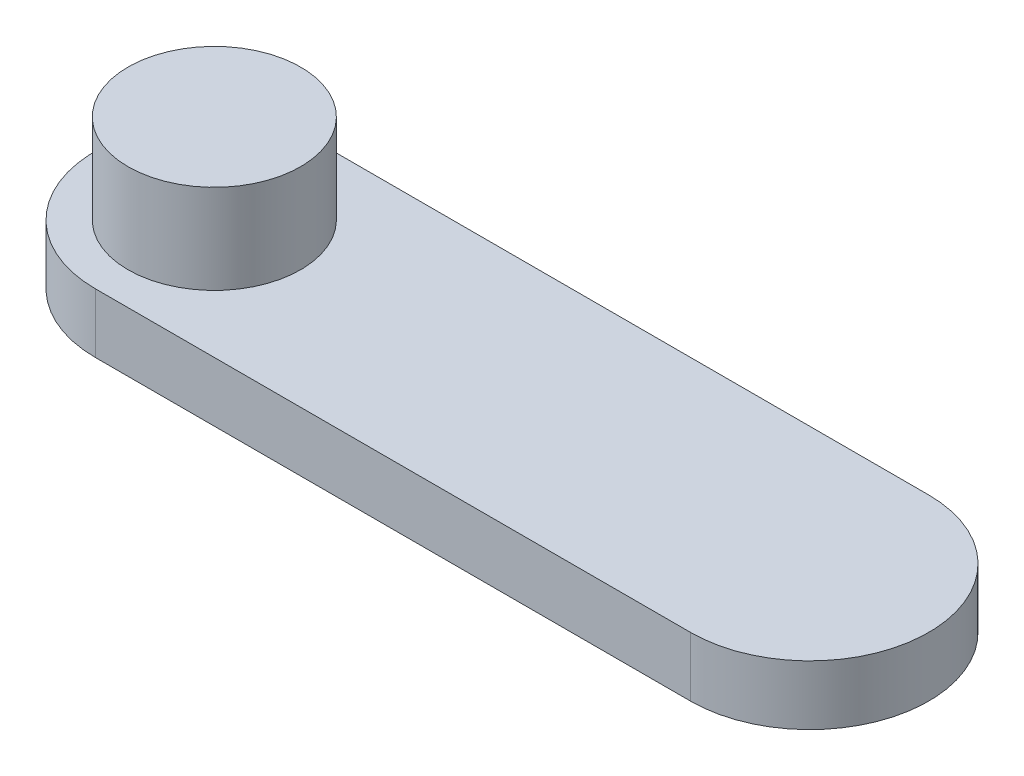
ISO-10303-21;
HEADER;
FILE_DESCRIPTION(('STEP AP214'),'2;1');
FILE_NAME('part.step','',(''),(''),'','','');
FILE_SCHEMA(('AUTOMOTIVE_DESIGN { 1 0 10303 214 1 1 1 1 }'));
ENDSEC;
DATA;
#1=APPLICATION_CONTEXT('core data for automotive mechanical design processes');
#2=APPLICATION_PROTOCOL_DEFINITION('international standard','automotive_design',2000,#1);
#3=PRODUCT_CONTEXT('',#1,'mechanical');
#4=PRODUCT('Part','Part','',(#3));
#5=PRODUCT_RELATED_PRODUCT_CATEGORY('part','',(#4));
#6=PRODUCT_DEFINITION_FORMATION('','',#4);
#7=PRODUCT_DEFINITION_CONTEXT('part definition',#1,'design');
#8=PRODUCT_DEFINITION('design','',#6,#7);
#9=PRODUCT_DEFINITION_SHAPE('','',#8);
#10=(LENGTH_UNIT() NAMED_UNIT(*) SI_UNIT(.MILLI.,.METRE.));
#11=(NAMED_UNIT(*) PLANE_ANGLE_UNIT() SI_UNIT($,.RADIAN.));
#12=(NAMED_UNIT(*) SI_UNIT($,.STERADIAN.) SOLID_ANGLE_UNIT());
#13=UNCERTAINTY_MEASURE_WITH_UNIT(LENGTH_MEASURE(1.E-05),#10,'distance_accuracy_value','');
#14=(GEOMETRIC_REPRESENTATION_CONTEXT(3) GLOBAL_UNCERTAINTY_ASSIGNED_CONTEXT((#13)) GLOBAL_UNIT_ASSIGNED_CONTEXT((#10,
#11,#12)) REPRESENTATION_CONTEXT('',''));
#15=CARTESIAN_POINT('',(0.,0.,0.));
#16=DIRECTION('',(0.,0.,1.));
#17=DIRECTION('',(1.,0.,0.));
#18=AXIS2_PLACEMENT_3D('',#15,#16,#17);
#19=CARTESIAN_POINT('',(-45.7401650890006,10.,0.));
#20=DIRECTION('',(0.,-1.,0.));
#21=DIRECTION('',(0.,0.,-1.));
#22=AXIS2_PLACEMENT_3D('',#19,#20,#21);
#23=CYLINDRICAL_SURFACE('',#22,20.);
#24=CARTESIAN_POINT('',(-45.7401650890006,0.,0.));
#25=DIRECTION('',(0.,1.,0.));
#26=DIRECTION('',(0.,0.,1.));
#27=AXIS2_PLACEMENT_3D('',#24,#25,#26);
#28=CIRCLE('',#27,20.);
#29=CARTESIAN_POINT('',(-45.7401650890006,0.,-20.));
#30=VERTEX_POINT('',#29);
#31=CARTESIAN_POINT('',(-45.7401650890006,0.,20.));
#32=VERTEX_POINT('',#31);
#33=EDGE_CURVE('E95',#30,#32,#28,.T.);
#34=ORIENTED_EDGE('',*,*,#33,.T.);
#35=DIRECTION('',(0.,-1.,0.));
#36=VECTOR('',#35,1.);
#37=CARTESIAN_POINT('',(-45.7401650890006,10.,20.));
#38=LINE('',#37,#36);
#39=CARTESIAN_POINT('',(-45.7401650890006,10.,20.));
#40=VERTEX_POINT('',#39);
#41=EDGE_CURVE('E11',#40,#32,#38,.T.);
#42=ORIENTED_EDGE('',*,*,#41,.F.);
#43=CARTESIAN_POINT('',(-45.7401650890006,10.,0.));
#44=DIRECTION('',(0.,1.,0.));
#45=DIRECTION('',(0.,0.,1.));
#46=AXIS2_PLACEMENT_3D('',#43,#44,#45);
#47=CIRCLE('',#46,20.);
#48=CARTESIAN_POINT('',(-45.7401650890006,10.,-20.));
#49=VERTEX_POINT('',#48);
#50=EDGE_CURVE('E83',#49,#40,#47,.T.);
#51=ORIENTED_EDGE('',*,*,#50,.F.);
#52=DIRECTION('',(0.,-1.,0.));
#53=VECTOR('',#52,1.);
#54=CARTESIAN_POINT('',(-45.7401650890006,10.,-20.));
#55=LINE('',#54,#53);
#56=EDGE_CURVE('E91',#49,#30,#55,.T.);
#57=ORIENTED_EDGE('',*,*,#56,.T.);
#58=EDGE_LOOP('',(#34,#42,#51,#57));
#59=FACE_BOUND('',#58,.T.);
#60=ADVANCED_FACE('F32',(#59),#23,.T.);
#61=CARTESIAN_POINT('',(-45.7401650890006,10.,20.));
#62=DIRECTION('',(0.,0.,-1.));
#63=DIRECTION('',(-1.,0.,0.));
#64=AXIS2_PLACEMENT_3D('',#61,#62,#63);
#65=PLANE('',#64);
#66=DIRECTION('',(1.,0.,0.));
#67=VECTOR('',#66,1.);
#68=CARTESIAN_POINT('',(-45.7401650890006,0.,20.));
#69=LINE('',#68,#67);
#70=CARTESIAN_POINT('',(54.2598349109994,0.,20.));
#71=VERTEX_POINT('',#70);
#72=EDGE_CURVE('E87',#32,#71,#69,.T.);
#73=ORIENTED_EDGE('',*,*,#72,.T.);
#74=DIRECTION('',(0.,-1.,0.));
#75=VECTOR('',#74,1.);
#76=CARTESIAN_POINT('',(54.2598349109994,10.,20.));
#77=LINE('',#76,#75);
#78=CARTESIAN_POINT('',(54.2598349109994,10.,20.));
#79=VERTEX_POINT('',#78);
#80=EDGE_CURVE('E40',#79,#71,#77,.T.);
#81=ORIENTED_EDGE('',*,*,#80,.F.);
#82=DIRECTION('',(1.,0.,0.));
#83=VECTOR('',#82,1.);
#84=CARTESIAN_POINT('',(-45.7401650890006,10.,20.));
#85=LINE('',#84,#83);
#86=EDGE_CURVE('E78',#40,#79,#85,.T.);
#87=ORIENTED_EDGE('',*,*,#86,.F.);
#88=ORIENTED_EDGE('',*,*,#41,.T.);
#89=EDGE_LOOP('',(#73,#81,#87,#88));
#90=FACE_BOUND('',#89,.T.);
#91=ADVANCED_FACE('F86',(#90),#65,.F.);
#92=CARTESIAN_POINT('',(54.2598349109994,10.,0.));
#93=DIRECTION('',(0.,-1.,0.));
#94=DIRECTION('',(0.,0.,-1.));
#95=AXIS2_PLACEMENT_3D('',#92,#93,#94);
#96=CYLINDRICAL_SURFACE('',#95,20.);
#97=CARTESIAN_POINT('',(54.2598349109994,0.,0.));
#98=DIRECTION('',(0.,1.,0.));
#99=DIRECTION('',(0.,0.,1.));
#100=AXIS2_PLACEMENT_3D('',#97,#98,#99);
#101=CIRCLE('',#100,20.);
#102=CARTESIAN_POINT('',(54.2598349109994,0.,-20.));
#103=VERTEX_POINT('',#102);
#104=EDGE_CURVE('E65',#71,#103,#101,.T.);
#105=ORIENTED_EDGE('',*,*,#104,.T.);
#106=DIRECTION('',(0.,-1.,0.));
#107=VECTOR('',#106,1.);
#108=CARTESIAN_POINT('',(54.2598349109994,10.,-20.));
#109=LINE('',#108,#107);
#110=CARTESIAN_POINT('',(54.2598349109994,10.,-20.));
#111=VERTEX_POINT('',#110);
#112=EDGE_CURVE('E88',#111,#103,#109,.T.);
#113=ORIENTED_EDGE('',*,*,#112,.F.);
#114=CARTESIAN_POINT('',(54.2598349109994,10.,0.));
#115=DIRECTION('',(0.,1.,0.));
#116=DIRECTION('',(0.,0.,1.));
#117=AXIS2_PLACEMENT_3D('',#114,#115,#116);
#118=CIRCLE('',#117,20.);
#119=EDGE_CURVE('E81',#79,#111,#118,.T.);
#120=ORIENTED_EDGE('',*,*,#119,.F.);
#121=ORIENTED_EDGE('',*,*,#80,.T.);
#122=EDGE_LOOP('',(#105,#113,#120,#121));
#123=FACE_BOUND('',#122,.T.);
#124=ADVANCED_FACE('F89',(#123),#96,.T.);
#125=CARTESIAN_POINT('',(-45.7401650890006,10.,-20.));
#126=DIRECTION('',(0.,0.,1.));
#127=DIRECTION('',(1.,0.,0.));
#128=AXIS2_PLACEMENT_3D('',#125,#126,#127);
#129=PLANE('',#128);
#130=DIRECTION('',(-1.,0.,0.));
#131=VECTOR('',#130,1.);
#132=CARTESIAN_POINT('',(-45.7401650890006,0.,-20.));
#133=LINE('',#132,#131);
#134=EDGE_CURVE('E71',#103,#30,#133,.T.);
#135=ORIENTED_EDGE('',*,*,#134,.T.);
#136=ORIENTED_EDGE('',*,*,#56,.F.);
#137=DIRECTION('',(-1.,0.,0.));
#138=VECTOR('',#137,1.);
#139=CARTESIAN_POINT('',(-45.7401650890006,10.,-20.));
#140=LINE('',#139,#138);
#141=EDGE_CURVE('E48',#111,#49,#140,.T.);
#142=ORIENTED_EDGE('',*,*,#141,.F.);
#143=ORIENTED_EDGE('',*,*,#112,.T.);
#144=EDGE_LOOP('',(#135,#136,#142,#143));
#145=FACE_BOUND('',#144,.T.);
#146=ADVANCED_FACE('F103',(#145),#129,.F.);
#147=CARTESIAN_POINT('',(-45.7401650890006,10.,0.));
#148=DIRECTION('',(0.,1.,0.));
#149=DIRECTION('',(0.,0.,1.));
#150=AXIS2_PLACEMENT_3D('',#147,#148,#149);
#151=PLANE('',#150);
#152=CARTESIAN_POINT('',(-45.7401650890006,10.,0.));
#153=DIRECTION('',(0.,1.,0.));
#154=DIRECTION('',(0.,0.,1.));
#155=AXIS2_PLACEMENT_3D('',#152,#153,#154);
#156=CIRCLE('',#155,14.5);
#157=CARTESIAN_POINT('',(-45.7401650890006,10.,14.5));
#158=VERTEX_POINT('',#157);
#159=EDGE_CURVE('E109',#158,#158,#156,.T.);
#160=ORIENTED_EDGE('',*,*,#159,.F.);
#161=EDGE_LOOP('',(#160));
#162=FACE_BOUND('',#161,.T.);
#163=ORIENTED_EDGE('',*,*,#50,.T.);
#164=ORIENTED_EDGE('',*,*,#86,.T.);
#165=ORIENTED_EDGE('',*,*,#119,.T.);
#166=ORIENTED_EDGE('',*,*,#141,.T.);
#167=EDGE_LOOP('',(#163,#164,#165,#166));
#168=FACE_BOUND('',#167,.T.);
#169=ADVANCED_FACE('F79',(#162,#168),#151,.T.);
#170=CARTESIAN_POINT('',(-45.7401650890006,0.,0.));
#171=DIRECTION('',(0.,1.,0.));
#172=DIRECTION('',(0.,0.,1.));
#173=AXIS2_PLACEMENT_3D('',#170,#171,#172);
#174=PLANE('',#173);
#175=ORIENTED_EDGE('',*,*,#33,.F.);
#176=ORIENTED_EDGE('',*,*,#134,.F.);
#177=ORIENTED_EDGE('',*,*,#104,.F.);
#178=ORIENTED_EDGE('',*,*,#72,.F.);
#179=EDGE_LOOP('',(#175,#176,#177,#178));
#180=FACE_BOUND('',#179,.T.);
#181=ADVANCED_FACE('F106',(#180),#174,.F.);
#182=CARTESIAN_POINT('',(-45.7401650890006,25.,0.));
#183=DIRECTION('',(0.,-1.,0.));
#184=DIRECTION('',(0.,0.,-1.));
#185=AXIS2_PLACEMENT_3D('',#182,#183,#184);
#186=CYLINDRICAL_SURFACE('',#185,14.5);
#187=CARTESIAN_POINT('',(-45.7401650890006,25.,0.));
#188=DIRECTION('',(0.,1.,0.));
#189=DIRECTION('',(0.,0.,1.));
#190=AXIS2_PLACEMENT_3D('',#187,#188,#189);
#191=CIRCLE('',#190,14.5);
#192=CARTESIAN_POINT('',(-45.7401650890006,25.,14.5));
#193=VERTEX_POINT('',#192);
#194=EDGE_CURVE('E98',#193,#193,#191,.T.);
#195=ORIENTED_EDGE('',*,*,#194,.F.);
#196=EDGE_LOOP('',(#195));
#197=FACE_BOUND('',#196,.T.);
#198=ORIENTED_EDGE('',*,*,#159,.T.);
#199=EDGE_LOOP('',(#198));
#200=FACE_BOUND('',#199,.T.);
#201=ADVANCED_FACE('F117',(#197,#200),#186,.T.);
#202=CARTESIAN_POINT('',(-45.7401650890006,25.,0.));
#203=DIRECTION('',(0.,1.,0.));
#204=DIRECTION('',(0.,0.,1.));
#205=AXIS2_PLACEMENT_3D('',#202,#203,#204);
#206=PLANE('',#205);
#207=ORIENTED_EDGE('',*,*,#194,.T.);
#208=EDGE_LOOP('',(#207));
#209=FACE_BOUND('',#208,.T.);
#210=ADVANCED_FACE('F115',(#209),#206,.T.);
#211=CLOSED_SHELL('',(#60,#91,#124,#146,#169,#181,#201,#210));
#212=MANIFOLD_SOLID_BREP('B2',#211);
#213=ADVANCED_BREP_SHAPE_REPRESENTATION('',(#18,#212),#14);
#214=SHAPE_DEFINITION_REPRESENTATION(#9,#213);
ENDSEC;
END-ISO-10303-21;
